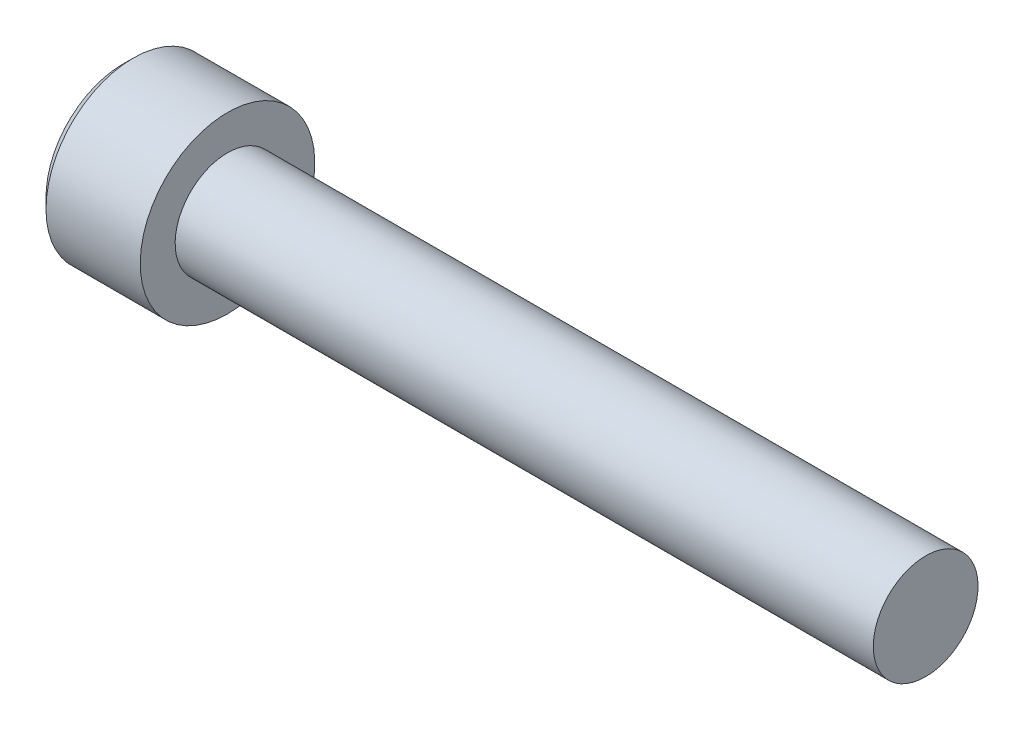
ISO-10303-21;
HEADER;
FILE_DESCRIPTION(('STEP AP214'),'2;1');
FILE_NAME('part.step','',(''),(''),'','','');
FILE_SCHEMA(('AUTOMOTIVE_DESIGN { 1 0 10303 214 1 1 1 1 }'));
ENDSEC;
DATA;
#1=APPLICATION_CONTEXT('core data for automotive mechanical design processes');
#2=APPLICATION_PROTOCOL_DEFINITION('international standard','automotive_design',2000,#1);
#3=PRODUCT_CONTEXT('',#1,'mechanical');
#4=PRODUCT('Part','Part','',(#3));
#5=PRODUCT_RELATED_PRODUCT_CATEGORY('part','',(#4));
#6=PRODUCT_DEFINITION_FORMATION('','',#4);
#7=PRODUCT_DEFINITION_CONTEXT('part definition',#1,'design');
#8=PRODUCT_DEFINITION('design','',#6,#7);
#9=PRODUCT_DEFINITION_SHAPE('','',#8);
#10=(LENGTH_UNIT() NAMED_UNIT(*) SI_UNIT(.MILLI.,.METRE.));
#11=(NAMED_UNIT(*) PLANE_ANGLE_UNIT() SI_UNIT($,.RADIAN.));
#12=(NAMED_UNIT(*) SI_UNIT($,.STERADIAN.) SOLID_ANGLE_UNIT());
#13=UNCERTAINTY_MEASURE_WITH_UNIT(LENGTH_MEASURE(1.E-05),#10,'distance_accuracy_value','');
#14=(GEOMETRIC_REPRESENTATION_CONTEXT(3) GLOBAL_UNCERTAINTY_ASSIGNED_CONTEXT((#13)) GLOBAL_UNIT_ASSIGNED_CONTEXT((#10,
#11,#12)) REPRESENTATION_CONTEXT('',''));
#15=CARTESIAN_POINT('',(0.,0.,0.));
#16=DIRECTION('',(0.,0.,1.));
#17=DIRECTION('',(1.,0.,0.));
#18=AXIS2_PLACEMENT_3D('',#15,#16,#17);
#19=CARTESIAN_POINT('',(0.,3.,0.));
#20=DIRECTION('',(-1.,0.,0.));
#21=DIRECTION('',(0.,-1.,0.));
#22=AXIS2_PLACEMENT_3D('',#19,#20,#21);
#23=PLANE('',#22);
#24=CARTESIAN_POINT('',(0.,0.,0.));
#25=DIRECTION('',(-1.,0.,0.));
#26=DIRECTION('',(0.,-1.,0.));
#27=AXIS2_PLACEMENT_3D('',#24,#25,#26);
#28=CIRCLE('',#27,5.);
#29=CARTESIAN_POINT('',(0.,-5.,0.));
#30=VERTEX_POINT('',#29);
#31=EDGE_CURVE('E193',#30,#30,#28,.T.);
#32=ORIENTED_EDGE('',*,*,#31,.F.);
#33=EDGE_LOOP('',(#32));
#34=FACE_BOUND('',#33,.T.);
#35=CARTESIAN_POINT('',(0.,0.,0.));
#36=DIRECTION('',(-1.,0.,0.));
#37=DIRECTION('',(0.,-1.,0.));
#38=AXIS2_PLACEMENT_3D('',#35,#36,#37);
#39=CIRCLE('',#38,3.);
#40=CARTESIAN_POINT('',(0.,-3.,0.));
#41=VERTEX_POINT('',#40);
#42=EDGE_CURVE('E186',#41,#41,#39,.T.);
#43=ORIENTED_EDGE('',*,*,#42,.T.);
#44=EDGE_LOOP('',(#43));
#45=FACE_BOUND('',#44,.T.);
#46=ADVANCED_FACE('F45',(#34,#45),#23,.F.);
#47=CARTESIAN_POINT('',(-6.,0.,0.));
#48=DIRECTION('',(-1.,0.,0.));
#49=DIRECTION('',(0.,-1.,0.));
#50=AXIS2_PLACEMENT_3D('',#47,#48,#49);
#51=CYLINDRICAL_SURFACE('',#50,5.);
#52=CARTESIAN_POINT('',(-5.40000000000001,0.,0.));
#53=DIRECTION('',(1.,0.,0.));
#54=DIRECTION('',(0.,1.,0.));
#55=AXIS2_PLACEMENT_3D('',#52,#53,#54);
#56=CIRCLE('',#55,5.);
#57=CARTESIAN_POINT('',(-5.40000000000001,5.,0.));
#58=VERTEX_POINT('',#57);
#59=EDGE_CURVE('E11',#58,#58,#56,.T.);
#60=ORIENTED_EDGE('',*,*,#59,.T.);
#61=EDGE_LOOP('',(#60));
#62=FACE_BOUND('',#61,.T.);
#63=ORIENTED_EDGE('',*,*,#31,.T.);
#64=EDGE_LOOP('',(#63));
#65=FACE_BOUND('',#64,.T.);
#66=ADVANCED_FACE('F212',(#62,#65),#51,.T.);
#67=CARTESIAN_POINT('',(-6.,0.,0.));
#68=DIRECTION('',(1.,0.,0.));
#69=DIRECTION('',(0.,1.,0.));
#70=AXIS2_PLACEMENT_3D('',#67,#68,#69);
#71=PLANE('',#70);
#72=CARTESIAN_POINT('',(-6.,0.,0.));
#73=DIRECTION('',(1.,0.,0.));
#74=DIRECTION('',(0.,1.,0.));
#75=AXIS2_PLACEMENT_3D('',#72,#73,#74);
#76=CIRCLE('',#75,4.40000000000001);
#77=CARTESIAN_POINT('',(-6.,4.40000000000001,0.));
#78=VERTEX_POINT('',#77);
#79=EDGE_CURVE('E53',#78,#78,#76,.F.);
#80=ORIENTED_EDGE('',*,*,#79,.T.);
#81=EDGE_LOOP('',(#80));
#82=FACE_BOUND('',#81,.T.);
#83=DIRECTION('',(0.,0.5,-0.866025403784439));
#84=VECTOR('',#83,1.);
#85=CARTESIAN_POINT('',(-6.,1.44337567297407,2.5));
#86=LINE('',#85,#84);
#87=CARTESIAN_POINT('',(-6.,1.44337567297407,2.5));
#88=VERTEX_POINT('',#87);
#89=CARTESIAN_POINT('',(-6.,2.88675134594813,0.));
#90=VERTEX_POINT('',#89);
#91=EDGE_CURVE('E158',#88,#90,#86,.T.);
#92=ORIENTED_EDGE('',*,*,#91,.F.);
#93=DIRECTION('',(0.,1.,0.));
#94=VECTOR('',#93,1.);
#95=CARTESIAN_POINT('',(-6.,-1.44337567297406,2.5));
#96=LINE('',#95,#94);
#97=CARTESIAN_POINT('',(-6.,-1.44337567297406,2.5));
#98=VERTEX_POINT('',#97);
#99=EDGE_CURVE('E60',#98,#88,#96,.T.);
#100=ORIENTED_EDGE('',*,*,#99,.F.);
#101=DIRECTION('',(0.,0.5,0.866025403784439));
#102=VECTOR('',#101,1.);
#103=CARTESIAN_POINT('',(-6.,-2.88675134594813,0.));
#104=LINE('',#103,#102);
#105=CARTESIAN_POINT('',(-6.,-2.88675134594813,0.));
#106=VERTEX_POINT('',#105);
#107=EDGE_CURVE('E126',#106,#98,#104,.T.);
#108=ORIENTED_EDGE('',*,*,#107,.F.);
#109=DIRECTION('',(0.,-0.5,0.866025403784438));
#110=VECTOR('',#109,1.);
#111=CARTESIAN_POINT('',(-6.,-1.44337567297406,-2.5));
#112=LINE('',#111,#110);
#113=CARTESIAN_POINT('',(-6.,-1.44337567297406,-2.5));
#114=VERTEX_POINT('',#113);
#115=EDGE_CURVE('E166',#114,#106,#112,.T.);
#116=ORIENTED_EDGE('',*,*,#115,.F.);
#117=DIRECTION('',(0.,-1.,0.));
#118=VECTOR('',#117,1.);
#119=CARTESIAN_POINT('',(-6.,1.44337567297407,-2.5));
#120=LINE('',#119,#118);
#121=CARTESIAN_POINT('',(-6.,1.44337567297407,-2.5));
#122=VERTEX_POINT('',#121);
#123=EDGE_CURVE('E163',#122,#114,#120,.T.);
#124=ORIENTED_EDGE('',*,*,#123,.F.);
#125=DIRECTION('',(0.,-0.5,-0.866025403784439));
#126=VECTOR('',#125,1.);
#127=CARTESIAN_POINT('',(-6.,2.88675134594813,0.));
#128=LINE('',#127,#126);
#129=EDGE_CURVE('E160',#90,#122,#128,.T.);
#130=ORIENTED_EDGE('',*,*,#129,.F.);
#131=EDGE_LOOP('',(#92,#100,#108,#116,#124,#130));
#132=FACE_BOUND('',#131,.T.);
#133=ADVANCED_FACE('F198',(#82,#132),#71,.F.);
#134=CARTESIAN_POINT('',(40.,3.,0.));
#135=DIRECTION('',(-1.,0.,0.));
#136=DIRECTION('',(0.,-1.,0.));
#137=AXIS2_PLACEMENT_3D('',#134,#135,#136);
#138=PLANE('',#137);
#139=CARTESIAN_POINT('',(40.,0.,0.));
#140=DIRECTION('',(-1.,0.,0.));
#141=DIRECTION('',(0.,-1.,0.));
#142=AXIS2_PLACEMENT_3D('',#139,#140,#141);
#143=CIRCLE('',#142,3.);
#144=CARTESIAN_POINT('',(40.,-3.,0.));
#145=VERTEX_POINT('',#144);
#146=EDGE_CURVE('E190',#145,#145,#143,.T.);
#147=ORIENTED_EDGE('',*,*,#146,.F.);
#148=EDGE_LOOP('',(#147));
#149=FACE_BOUND('',#148,.T.);
#150=ADVANCED_FACE('F224',(#149),#138,.F.);
#151=CARTESIAN_POINT('',(-6.,0.,0.));
#152=DIRECTION('',(-1.,0.,0.));
#153=DIRECTION('',(0.,-1.,0.));
#154=AXIS2_PLACEMENT_3D('',#151,#152,#153);
#155=CYLINDRICAL_SURFACE('',#154,3.);
#156=ORIENTED_EDGE('',*,*,#42,.F.);
#157=EDGE_LOOP('',(#156));
#158=FACE_BOUND('',#157,.T.);
#159=ORIENTED_EDGE('',*,*,#146,.T.);
#160=EDGE_LOOP('',(#159));
#161=FACE_BOUND('',#160,.T.);
#162=ADVANCED_FACE('F226',(#158,#161),#155,.T.);
#163=CARTESIAN_POINT('',(-3.,-1.44337567297406,2.5));
#164=DIRECTION('',(0.,0.,1.));
#165=DIRECTION('',(1.,0.,0.));
#166=AXIS2_PLACEMENT_3D('',#163,#164,#165);
#167=PLANE('',#166);
#168=DIRECTION('',(0.,1.,0.));
#169=VECTOR('',#168,1.);
#170=CARTESIAN_POINT('',(-3.,-1.44337567297406,2.5));
#171=LINE('',#170,#169);
#172=CARTESIAN_POINT('',(-3.,-1.44337567297406,2.5));
#173=VERTEX_POINT('',#172);
#174=CARTESIAN_POINT('',(-3.,0.,2.5));
#175=VERTEX_POINT('',#174);
#176=EDGE_CURVE('E125',#173,#175,#171,.T.);
#177=ORIENTED_EDGE('',*,*,#176,.F.);
#178=DIRECTION('',(-1.,0.,0.));
#179=VECTOR('',#178,1.);
#180=CARTESIAN_POINT('',(-3.,-1.44337567297406,2.5));
#181=LINE('',#180,#179);
#182=EDGE_CURVE('E170',#173,#98,#181,.T.);
#183=ORIENTED_EDGE('',*,*,#182,.T.);
#184=ORIENTED_EDGE('',*,*,#99,.T.);
#185=DIRECTION('',(-1.,0.,0.));
#186=VECTOR('',#185,1.);
#187=CARTESIAN_POINT('',(-3.,1.44337567297407,2.5));
#188=LINE('',#187,#186);
#189=CARTESIAN_POINT('',(-3.,1.44337567297407,2.5));
#190=VERTEX_POINT('',#189);
#191=EDGE_CURVE('E129',#190,#88,#188,.T.);
#192=ORIENTED_EDGE('',*,*,#191,.F.);
#193=EDGE_CURVE('E119',#175,#190,#171,.T.);
#194=ORIENTED_EDGE('',*,*,#193,.F.);
#195=EDGE_LOOP('',(#177,#183,#184,#192,#194));
#196=FACE_BOUND('',#195,.T.);
#197=ADVANCED_FACE('F130',(#196),#167,.F.);
#198=CARTESIAN_POINT('',(-3.,-2.88675134594813,0.));
#199=DIRECTION('',(0.,-0.866025403784439,0.5));
#200=DIRECTION('',(0.,-0.5,-0.866025403784439));
#201=AXIS2_PLACEMENT_3D('',#198,#199,#200);
#202=PLANE('',#201);
#203=DIRECTION('',(0.,0.5,0.866025403784439));
#204=VECTOR('',#203,1.);
#205=CARTESIAN_POINT('',(-3.,-2.88675134594813,0.));
#206=LINE('',#205,#204);
#207=CARTESIAN_POINT('',(-3.,-2.88675134594813,0.));
#208=VERTEX_POINT('',#207);
#209=CARTESIAN_POINT('',(-3.,-2.1650635094611,1.25));
#210=VERTEX_POINT('',#209);
#211=EDGE_CURVE('E134',#208,#210,#206,.T.);
#212=ORIENTED_EDGE('',*,*,#211,.F.);
#213=DIRECTION('',(-1.,0.,0.));
#214=VECTOR('',#213,1.);
#215=CARTESIAN_POINT('',(-3.,-2.88675134594813,0.));
#216=LINE('',#215,#214);
#217=EDGE_CURVE('E173',#208,#106,#216,.T.);
#218=ORIENTED_EDGE('',*,*,#217,.T.);
#219=ORIENTED_EDGE('',*,*,#107,.T.);
#220=ORIENTED_EDGE('',*,*,#182,.F.);
#221=EDGE_CURVE('E154',#210,#173,#206,.T.);
#222=ORIENTED_EDGE('',*,*,#221,.F.);
#223=EDGE_LOOP('',(#212,#218,#219,#220,#222));
#224=FACE_BOUND('',#223,.T.);
#225=ADVANCED_FACE('F233',(#224),#202,.F.);
#226=CARTESIAN_POINT('',(-3.,-1.44337567297406,-2.5));
#227=DIRECTION('',(0.,-0.866025403784439,-0.5));
#228=DIRECTION('',(0.,0.5,-0.866025403784439));
#229=AXIS2_PLACEMENT_3D('',#226,#227,#228);
#230=PLANE('',#229);
#231=DIRECTION('',(0.,-0.5,0.866025403784438));
#232=VECTOR('',#231,1.);
#233=CARTESIAN_POINT('',(-3.,-1.44337567297406,-2.5));
#234=LINE('',#233,#232);
#235=CARTESIAN_POINT('',(-3.,-1.44337567297406,-2.5));
#236=VERTEX_POINT('',#235);
#237=CARTESIAN_POINT('',(-3.,-2.1650635094611,-1.25));
#238=VERTEX_POINT('',#237);
#239=EDGE_CURVE('E151',#236,#238,#234,.T.);
#240=ORIENTED_EDGE('',*,*,#239,.F.);
#241=DIRECTION('',(-1.,0.,0.));
#242=VECTOR('',#241,1.);
#243=CARTESIAN_POINT('',(-3.,-1.44337567297406,-2.5));
#244=LINE('',#243,#242);
#245=EDGE_CURVE('E176',#236,#114,#244,.T.);
#246=ORIENTED_EDGE('',*,*,#245,.T.);
#247=ORIENTED_EDGE('',*,*,#115,.T.);
#248=ORIENTED_EDGE('',*,*,#217,.F.);
#249=EDGE_CURVE('E150',#238,#208,#234,.T.);
#250=ORIENTED_EDGE('',*,*,#249,.F.);
#251=EDGE_LOOP('',(#240,#246,#247,#248,#250));
#252=FACE_BOUND('',#251,.T.);
#253=ADVANCED_FACE('F244',(#252),#230,.F.);
#254=CARTESIAN_POINT('',(-3.,1.44337567297407,-2.5));
#255=DIRECTION('',(0.,0.,-1.));
#256=DIRECTION('',(-1.,0.,0.));
#257=AXIS2_PLACEMENT_3D('',#254,#255,#256);
#258=PLANE('',#257);
#259=DIRECTION('',(0.,-1.,0.));
#260=VECTOR('',#259,1.);
#261=CARTESIAN_POINT('',(-3.,1.44337567297407,-2.5));
#262=LINE('',#261,#260);
#263=CARTESIAN_POINT('',(-3.,1.44337567297407,-2.5));
#264=VERTEX_POINT('',#263);
#265=CARTESIAN_POINT('',(-3.,0.,-2.5));
#266=VERTEX_POINT('',#265);
#267=EDGE_CURVE('E147',#264,#266,#262,.T.);
#268=ORIENTED_EDGE('',*,*,#267,.F.);
#269=DIRECTION('',(-1.,0.,0.));
#270=VECTOR('',#269,1.);
#271=CARTESIAN_POINT('',(-3.,1.44337567297407,-2.5));
#272=LINE('',#271,#270);
#273=EDGE_CURVE('E179',#264,#122,#272,.T.);
#274=ORIENTED_EDGE('',*,*,#273,.T.);
#275=ORIENTED_EDGE('',*,*,#123,.T.);
#276=ORIENTED_EDGE('',*,*,#245,.F.);
#277=EDGE_CURVE('E146',#266,#236,#262,.T.);
#278=ORIENTED_EDGE('',*,*,#277,.F.);
#279=EDGE_LOOP('',(#268,#274,#275,#276,#278));
#280=FACE_BOUND('',#279,.T.);
#281=ADVANCED_FACE('F240',(#280),#258,.F.);
#282=CARTESIAN_POINT('',(-3.,2.88675134594813,0.));
#283=DIRECTION('',(0.,0.866025403784439,-0.5));
#284=DIRECTION('',(0.,0.5,0.866025403784439));
#285=AXIS2_PLACEMENT_3D('',#282,#283,#284);
#286=PLANE('',#285);
#287=DIRECTION('',(0.,-0.5,-0.866025403784439));
#288=VECTOR('',#287,1.);
#289=CARTESIAN_POINT('',(-3.,2.88675134594813,0.));
#290=LINE('',#289,#288);
#291=CARTESIAN_POINT('',(-3.,2.88675134594813,0.));
#292=VERTEX_POINT('',#291);
#293=CARTESIAN_POINT('',(-3.,2.1650635094611,-1.25));
#294=VERTEX_POINT('',#293);
#295=EDGE_CURVE('E142',#292,#294,#290,.T.);
#296=ORIENTED_EDGE('',*,*,#295,.F.);
#297=DIRECTION('',(-1.,0.,0.));
#298=VECTOR('',#297,1.);
#299=CARTESIAN_POINT('',(-3.,2.88675134594813,0.));
#300=LINE('',#299,#298);
#301=EDGE_CURVE('E133',#292,#90,#300,.T.);
#302=ORIENTED_EDGE('',*,*,#301,.T.);
#303=ORIENTED_EDGE('',*,*,#129,.T.);
#304=ORIENTED_EDGE('',*,*,#273,.F.);
#305=EDGE_CURVE('E140',#294,#264,#290,.T.);
#306=ORIENTED_EDGE('',*,*,#305,.F.);
#307=EDGE_LOOP('',(#296,#302,#303,#304,#306));
#308=FACE_BOUND('',#307,.T.);
#309=ADVANCED_FACE('F237',(#308),#286,.F.);
#310=CARTESIAN_POINT('',(-3.,1.44337567297407,2.5));
#311=DIRECTION('',(0.,0.866025403784439,0.5));
#312=DIRECTION('',(0.,-0.5,0.866025403784439));
#313=AXIS2_PLACEMENT_3D('',#310,#311,#312);
#314=PLANE('',#313);
#315=DIRECTION('',(0.,0.5,-0.866025403784439));
#316=VECTOR('',#315,1.);
#317=CARTESIAN_POINT('',(-3.,1.44337567297407,2.5));
#318=LINE('',#317,#316);
#319=CARTESIAN_POINT('',(-3.,2.1650635094611,1.25));
#320=VERTEX_POINT('',#319);
#321=EDGE_CURVE('E68',#190,#320,#318,.T.);
#322=ORIENTED_EDGE('',*,*,#321,.F.);
#323=ORIENTED_EDGE('',*,*,#191,.T.);
#324=ORIENTED_EDGE('',*,*,#91,.T.);
#325=ORIENTED_EDGE('',*,*,#301,.F.);
#326=EDGE_CURVE('E138',#320,#292,#318,.T.);
#327=ORIENTED_EDGE('',*,*,#326,.F.);
#328=EDGE_LOOP('',(#322,#323,#324,#325,#327));
#329=FACE_BOUND('',#328,.T.);
#330=ADVANCED_FACE('F136',(#329),#314,.F.);
#331=CARTESIAN_POINT('',(-3.,0.,0.));
#332=DIRECTION('',(-1.,0.,0.));
#333=DIRECTION('',(0.,0.,1.));
#334=AXIS2_PLACEMENT_3D('',#331,#332,#333);
#335=PLANE('',#334);
#336=CARTESIAN_POINT('',(-3.,0.,0.));
#337=DIRECTION('',(1.,0.,0.));
#338=DIRECTION('',(0.,0.,-1.));
#339=AXIS2_PLACEMENT_3D('',#336,#337,#338);
#340=CIRCLE('',#339,2.5);
#341=EDGE_CURVE('E277',#175,#210,#340,.T.);
#342=ORIENTED_EDGE('',*,*,#341,.T.);
#343=ORIENTED_EDGE('',*,*,#221,.T.);
#344=ORIENTED_EDGE('',*,*,#176,.T.);
#345=EDGE_LOOP('',(#342,#343,#344));
#346=FACE_BOUND('',#345,.T.);
#347=ADVANCED_FACE('F236',(#346),#335,.T.);
#348=EDGE_CURVE('E278',#210,#238,#340,.T.);
#349=ORIENTED_EDGE('',*,*,#348,.T.);
#350=ORIENTED_EDGE('',*,*,#249,.T.);
#351=ORIENTED_EDGE('',*,*,#211,.T.);
#352=EDGE_LOOP('',(#349,#350,#351));
#353=FACE_BOUND('',#352,.T.);
#354=ADVANCED_FACE('F253',(#353),#335,.T.);
#355=EDGE_CURVE('E172',#238,#266,#340,.T.);
#356=ORIENTED_EDGE('',*,*,#355,.T.);
#357=ORIENTED_EDGE('',*,*,#277,.T.);
#358=ORIENTED_EDGE('',*,*,#239,.T.);
#359=EDGE_LOOP('',(#356,#357,#358));
#360=FACE_BOUND('',#359,.T.);
#361=ADVANCED_FACE('F258',(#360),#335,.T.);
#362=EDGE_CURVE('E184',#266,#294,#340,.T.);
#363=ORIENTED_EDGE('',*,*,#362,.T.);
#364=ORIENTED_EDGE('',*,*,#305,.T.);
#365=ORIENTED_EDGE('',*,*,#267,.T.);
#366=EDGE_LOOP('',(#363,#364,#365));
#367=FACE_BOUND('',#366,.T.);
#368=ADVANCED_FACE('F265',(#367),#335,.T.);
#369=EDGE_CURVE('E187',#294,#320,#340,.T.);
#370=ORIENTED_EDGE('',*,*,#369,.T.);
#371=ORIENTED_EDGE('',*,*,#326,.T.);
#372=ORIENTED_EDGE('',*,*,#295,.T.);
#373=EDGE_LOOP('',(#370,#371,#372));
#374=FACE_BOUND('',#373,.T.);
#375=ADVANCED_FACE('F261',(#374),#335,.T.);
#376=EDGE_CURVE('E122',#320,#175,#340,.T.);
#377=ORIENTED_EDGE('',*,*,#376,.T.);
#378=ORIENTED_EDGE('',*,*,#193,.T.);
#379=ORIENTED_EDGE('',*,*,#321,.T.);
#380=EDGE_LOOP('',(#377,#378,#379));
#381=FACE_BOUND('',#380,.T.);
#382=ADVANCED_FACE('F120',(#381),#335,.T.);
#383=CARTESIAN_POINT('',(-1.49784845243108,0.,0.));
#384=DIRECTION('',(-1.,0.,0.));
#385=DIRECTION('',(0.,0.,1.));
#386=AXIS2_PLACEMENT_3D('',#383,#384,#385);
#387=CONICAL_SURFACE('',#386,0.,1.02974425867665);
#388=ORIENTED_EDGE('',*,*,#362,.F.);
#389=ORIENTED_EDGE('',*,*,#355,.F.);
#390=ORIENTED_EDGE('',*,*,#348,.F.);
#391=ORIENTED_EDGE('',*,*,#341,.F.);
#392=ORIENTED_EDGE('',*,*,#376,.F.);
#393=ORIENTED_EDGE('',*,*,#369,.F.);
#394=EDGE_LOOP('',(#388,#389,#390,#391,#392,#393));
#395=FACE_BOUND('',#394,.T.);
#396=CARTESIAN_POINT('',(-1.49784845243108,0.,0.));
#397=VERTEX_POINT('',#396);
#398=VERTEX_LOOP('',#397);
#399=FACE_BOUND('',#398,.T.);
#400=ADVANCED_FACE('F202',(#395,#399),#387,.F.);
#401=CARTESIAN_POINT('',(-6.,0.,0.));
#402=DIRECTION('',(1.,0.,0.));
#403=DIRECTION('',(0.,1.,0.));
#404=AXIS2_PLACEMENT_3D('',#401,#402,#403);
#405=CONICAL_SURFACE('',#404,4.40000000000001,0.78539816339745);
#406=ORIENTED_EDGE('',*,*,#59,.F.);
#407=EDGE_LOOP('',(#406));
#408=FACE_BOUND('',#407,.T.);
#409=ORIENTED_EDGE('',*,*,#79,.F.);
#410=EDGE_LOOP('',(#409));
#411=FACE_BOUND('',#410,.T.);
#412=ADVANCED_FACE('F47',(#408,#411),#405,.T.);
#413=CLOSED_SHELL('',(#46,#66,#133,#150,#162,#197,#225,#253,#281,#309,#330,#347,#354,#361,#368,
#375,#382,#400,#412));
#414=MANIFOLD_SOLID_BREP('B2',#413);
#415=ADVANCED_BREP_SHAPE_REPRESENTATION('',(#18,#414),#14);
#416=SHAPE_DEFINITION_REPRESENTATION(#9,#415);
ENDSEC;
END-ISO-10303-21;
